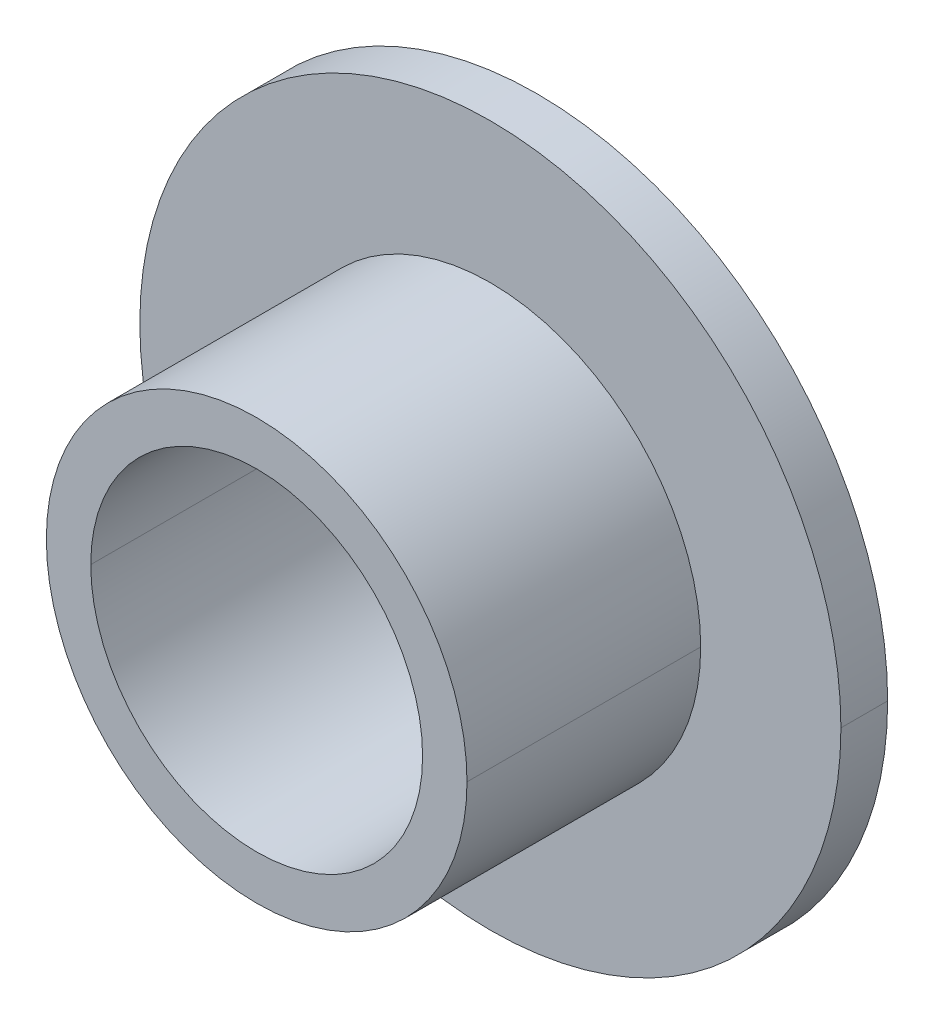
ISO-10303-21;
HEADER;
FILE_DESCRIPTION(('STEP AP214'),'2;1');
FILE_NAME('part.step','',(''),(''),'','','');
FILE_SCHEMA(('AUTOMOTIVE_DESIGN { 1 0 10303 214 1 1 1 1 }'));
ENDSEC;
DATA;
#1=APPLICATION_CONTEXT('core data for automotive mechanical design processes');
#2=APPLICATION_PROTOCOL_DEFINITION('international standard','automotive_design',2000,#1);
#3=PRODUCT_CONTEXT('',#1,'mechanical');
#4=PRODUCT('Part','Part','',(#3));
#5=PRODUCT_RELATED_PRODUCT_CATEGORY('part','',(#4));
#6=PRODUCT_DEFINITION_FORMATION('','',#4);
#7=PRODUCT_DEFINITION_CONTEXT('part definition',#1,'design');
#8=PRODUCT_DEFINITION('design','',#6,#7);
#9=PRODUCT_DEFINITION_SHAPE('','',#8);
#10=(LENGTH_UNIT() NAMED_UNIT(*) SI_UNIT(.MILLI.,.METRE.));
#11=(NAMED_UNIT(*) PLANE_ANGLE_UNIT() SI_UNIT($,.RADIAN.));
#12=(NAMED_UNIT(*) SI_UNIT($,.STERADIAN.) SOLID_ANGLE_UNIT());
#13=UNCERTAINTY_MEASURE_WITH_UNIT(LENGTH_MEASURE(1.E-05),#10,'distance_accuracy_value','');
#14=(GEOMETRIC_REPRESENTATION_CONTEXT(3) GLOBAL_UNCERTAINTY_ASSIGNED_CONTEXT((#13)) GLOBAL_UNIT_ASSIGNED_CONTEXT((#10,
#11,#12)) REPRESENTATION_CONTEXT('',''));
#15=CARTESIAN_POINT('',(0.,0.,0.));
#16=DIRECTION('',(0.,0.,1.));
#17=DIRECTION('',(1.,0.,0.));
#18=AXIS2_PLACEMENT_3D('',#15,#16,#17);
#19=CARTESIAN_POINT('',(0.,0.,6.));
#20=DIRECTION('',(0.,0.,-1.));
#21=DIRECTION('',(-1.,0.,0.));
#22=AXIS2_PLACEMENT_3D('',#19,#20,#21);
#23=CYLINDRICAL_SURFACE('',#22,4.5);
#24=DIRECTION('',(0.,0.,-1.));
#25=VECTOR('',#24,1.);
#26=CARTESIAN_POINT('',(4.5,0.,6.));
#27=LINE('',#26,#25);
#28=CARTESIAN_POINT('',(4.5,0.,6.));
#29=VERTEX_POINT('',#28);
#30=CARTESIAN_POINT('',(4.5,0.,1.));
#31=VERTEX_POINT('',#30);
#32=EDGE_CURVE('E73',#29,#31,#27,.T.);
#33=ORIENTED_EDGE('',*,*,#32,.F.);
#34=CARTESIAN_POINT('',(0.,0.,6.));
#35=DIRECTION('',(0.,0.,-1.));
#36=DIRECTION('',(-1.,0.,0.));
#37=AXIS2_PLACEMENT_3D('',#34,#35,#36);
#38=CIRCLE('',#37,4.5);
#39=CARTESIAN_POINT('',(-4.5,0.,6.));
#40=VERTEX_POINT('',#39);
#41=EDGE_CURVE('E83',#40,#29,#38,.F.);
#42=ORIENTED_EDGE('',*,*,#41,.F.);
#43=DIRECTION('',(0.,0.,-1.));
#44=VECTOR('',#43,1.);
#45=CARTESIAN_POINT('',(-4.5,0.,6.));
#46=LINE('',#45,#44);
#47=CARTESIAN_POINT('',(-4.5,0.,1.));
#48=VERTEX_POINT('',#47);
#49=EDGE_CURVE('E66',#48,#40,#46,.F.);
#50=ORIENTED_EDGE('',*,*,#49,.F.);
#51=CARTESIAN_POINT('',(0.,0.,1.));
#52=DIRECTION('',(0.,0.,-1.));
#53=DIRECTION('',(-1.,0.,0.));
#54=AXIS2_PLACEMENT_3D('',#51,#52,#53);
#55=CIRCLE('',#54,4.5);
#56=EDGE_CURVE('E82',#31,#48,#55,.T.);
#57=ORIENTED_EDGE('',*,*,#56,.F.);
#58=EDGE_LOOP('',(#33,#42,#50,#57));
#59=FACE_BOUND('',#58,.T.);
#60=ADVANCED_FACE('F17',(#59),#23,.T.);
#61=CARTESIAN_POINT('',(0.,0.,6.));
#62=DIRECTION('',(0.,0.,-1.));
#63=DIRECTION('',(-1.,0.,0.));
#64=AXIS2_PLACEMENT_3D('',#61,#62,#63);
#65=CYLINDRICAL_SURFACE('',#64,4.5);
#66=ORIENTED_EDGE('',*,*,#49,.T.);
#67=CARTESIAN_POINT('',(0.,0.,6.));
#68=DIRECTION('',(0.,0.,-1.));
#69=DIRECTION('',(-1.,0.,0.));
#70=AXIS2_PLACEMENT_3D('',#67,#68,#69);
#71=CIRCLE('',#70,4.5);
#72=EDGE_CURVE('E77',#29,#40,#71,.F.);
#73=ORIENTED_EDGE('',*,*,#72,.F.);
#74=ORIENTED_EDGE('',*,*,#32,.T.);
#75=CARTESIAN_POINT('',(0.,0.,1.));
#76=DIRECTION('',(0.,0.,-1.));
#77=DIRECTION('',(-1.,0.,0.));
#78=AXIS2_PLACEMENT_3D('',#75,#76,#77);
#79=CIRCLE('',#78,4.5);
#80=EDGE_CURVE('E20',#48,#31,#79,.T.);
#81=ORIENTED_EDGE('',*,*,#80,.F.);
#82=EDGE_LOOP('',(#66,#73,#74,#81));
#83=FACE_BOUND('',#82,.T.);
#84=ADVANCED_FACE('F75',(#83),#65,.T.);
#85=CARTESIAN_POINT('',(0.,0.,1.));
#86=DIRECTION('',(0.,0.,1.));
#87=DIRECTION('',(1.,0.,0.));
#88=AXIS2_PLACEMENT_3D('',#85,#86,#87);
#89=PLANE('',#88);
#90=ORIENTED_EDGE('',*,*,#80,.T.);
#91=ORIENTED_EDGE('',*,*,#56,.T.);
#92=EDGE_LOOP('',(#90,#91));
#93=FACE_BOUND('',#92,.T.);
#94=CARTESIAN_POINT('',(0.,0.,1.));
#95=DIRECTION('',(0.,0.,-1.));
#96=DIRECTION('',(-1.,0.,0.));
#97=AXIS2_PLACEMENT_3D('',#94,#95,#96);
#98=CIRCLE('',#97,7.5);
#99=CARTESIAN_POINT('',(7.5,0.,1.));
#100=VERTEX_POINT('',#99);
#101=CARTESIAN_POINT('',(-7.5,0.,1.));
#102=VERTEX_POINT('',#101);
#103=EDGE_CURVE('E87',#100,#102,#98,.T.);
#104=ORIENTED_EDGE('',*,*,#103,.F.);
#105=CARTESIAN_POINT('',(0.,0.,1.));
#106=DIRECTION('',(0.,0.,-1.));
#107=DIRECTION('',(-1.,0.,0.));
#108=AXIS2_PLACEMENT_3D('',#105,#106,#107);
#109=CIRCLE('',#108,7.5);
#110=EDGE_CURVE('E90',#102,#100,#109,.T.);
#111=ORIENTED_EDGE('',*,*,#110,.F.);
#112=EDGE_LOOP('',(#104,#111));
#113=FACE_BOUND('',#112,.T.);
#114=ADVANCED_FACE('F80',(#93,#113),#89,.T.);
#115=CARTESIAN_POINT('',(0.,0.,6.));
#116=DIRECTION('',(0.,0.,1.));
#117=DIRECTION('',(1.,0.,0.));
#118=AXIS2_PLACEMENT_3D('',#115,#116,#117);
#119=PLANE('',#118);
#120=CARTESIAN_POINT('',(0.,0.,6.));
#121=DIRECTION('',(0.,0.,-1.));
#122=DIRECTION('',(-1.,0.,0.));
#123=AXIS2_PLACEMENT_3D('',#120,#121,#122);
#124=CIRCLE('',#123,3.55);
#125=CARTESIAN_POINT('',(3.55,0.,6.));
#126=VERTEX_POINT('',#125);
#127=CARTESIAN_POINT('',(-3.55,0.,6.));
#128=VERTEX_POINT('',#127);
#129=EDGE_CURVE('E93',#126,#128,#124,.T.);
#130=ORIENTED_EDGE('',*,*,#129,.T.);
#131=CARTESIAN_POINT('',(0.,0.,6.));
#132=DIRECTION('',(0.,0.,-1.));
#133=DIRECTION('',(-1.,0.,0.));
#134=AXIS2_PLACEMENT_3D('',#131,#132,#133);
#135=CIRCLE('',#134,3.55);
#136=EDGE_CURVE('E97',#128,#126,#135,.T.);
#137=ORIENTED_EDGE('',*,*,#136,.T.);
#138=EDGE_LOOP('',(#130,#137));
#139=FACE_BOUND('',#138,.T.);
#140=ORIENTED_EDGE('',*,*,#41,.T.);
#141=ORIENTED_EDGE('',*,*,#72,.T.);
#142=EDGE_LOOP('',(#140,#141));
#143=FACE_BOUND('',#142,.T.);
#144=ADVANCED_FACE('F133',(#139,#143),#119,.T.);
#145=CARTESIAN_POINT('',(0.,0.,1.));
#146=DIRECTION('',(0.,0.,-1.));
#147=DIRECTION('',(-1.,0.,0.));
#148=AXIS2_PLACEMENT_3D('',#145,#146,#147);
#149=CYLINDRICAL_SURFACE('',#148,7.5);
#150=DIRECTION('',(0.,0.,-1.));
#151=VECTOR('',#150,1.);
#152=CARTESIAN_POINT('',(7.5,0.,1.));
#153=LINE('',#152,#151);
#154=CARTESIAN_POINT('',(7.5,0.,0.));
#155=VERTEX_POINT('',#154);
#156=EDGE_CURVE('E89',#100,#155,#153,.T.);
#157=ORIENTED_EDGE('',*,*,#156,.F.);
#158=ORIENTED_EDGE('',*,*,#103,.T.);
#159=DIRECTION('',(0.,0.,-1.));
#160=VECTOR('',#159,1.);
#161=CARTESIAN_POINT('',(-7.5,0.,1.));
#162=LINE('',#161,#160);
#163=CARTESIAN_POINT('',(-7.5,0.,0.));
#164=VERTEX_POINT('',#163);
#165=EDGE_CURVE('E94',#164,#102,#162,.F.);
#166=ORIENTED_EDGE('',*,*,#165,.F.);
#167=CARTESIAN_POINT('',(0.,0.,0.));
#168=DIRECTION('',(0.,0.,-1.));
#169=DIRECTION('',(-1.,0.,0.));
#170=AXIS2_PLACEMENT_3D('',#167,#168,#169);
#171=CIRCLE('',#170,7.5);
#172=EDGE_CURVE('E101',#164,#155,#171,.F.);
#173=ORIENTED_EDGE('',*,*,#172,.T.);
#174=EDGE_LOOP('',(#157,#158,#166,#173));
#175=FACE_BOUND('',#174,.T.);
#176=ADVANCED_FACE('F128',(#175),#149,.T.);
#177=CARTESIAN_POINT('',(0.,0.,1.));
#178=DIRECTION('',(0.,0.,-1.));
#179=DIRECTION('',(-1.,0.,0.));
#180=AXIS2_PLACEMENT_3D('',#177,#178,#179);
#181=CYLINDRICAL_SURFACE('',#180,7.5);
#182=ORIENTED_EDGE('',*,*,#165,.T.);
#183=ORIENTED_EDGE('',*,*,#110,.T.);
#184=ORIENTED_EDGE('',*,*,#156,.T.);
#185=CARTESIAN_POINT('',(0.,0.,0.));
#186=DIRECTION('',(0.,0.,-1.));
#187=DIRECTION('',(-1.,0.,0.));
#188=AXIS2_PLACEMENT_3D('',#185,#186,#187);
#189=CIRCLE('',#188,7.5);
#190=EDGE_CURVE('E104',#155,#164,#189,.F.);
#191=ORIENTED_EDGE('',*,*,#190,.T.);
#192=EDGE_LOOP('',(#182,#183,#184,#191));
#193=FACE_BOUND('',#192,.T.);
#194=ADVANCED_FACE('F131',(#193),#181,.T.);
#195=CARTESIAN_POINT('',(0.,0.,6.));
#196=DIRECTION('',(0.,0.,-1.));
#197=DIRECTION('',(-1.,0.,0.));
#198=AXIS2_PLACEMENT_3D('',#195,#196,#197);
#199=CYLINDRICAL_SURFACE('',#198,3.55);
#200=CARTESIAN_POINT('',(0.,0.,0.));
#201=DIRECTION('',(0.,0.,-1.));
#202=DIRECTION('',(-1.,0.,0.));
#203=AXIS2_PLACEMENT_3D('',#200,#201,#202);
#204=CIRCLE('',#203,3.55);
#205=CARTESIAN_POINT('',(3.55,0.,0.));
#206=VERTEX_POINT('',#205);
#207=CARTESIAN_POINT('',(-3.55,0.,0.));
#208=VERTEX_POINT('',#207);
#209=EDGE_CURVE('E26',#206,#208,#204,.T.);
#210=ORIENTED_EDGE('',*,*,#209,.T.);
#211=DIRECTION('',(0.,0.,-1.));
#212=VECTOR('',#211,1.);
#213=CARTESIAN_POINT('',(-3.55,0.,6.));
#214=LINE('',#213,#212);
#215=EDGE_CURVE('E34',#208,#128,#214,.F.);
#216=ORIENTED_EDGE('',*,*,#215,.T.);
#217=ORIENTED_EDGE('',*,*,#129,.F.);
#218=DIRECTION('',(0.,0.,-1.));
#219=VECTOR('',#218,1.);
#220=CARTESIAN_POINT('',(3.55,0.,6.));
#221=LINE('',#220,#219);
#222=EDGE_CURVE('E100',#126,#206,#221,.T.);
#223=ORIENTED_EDGE('',*,*,#222,.T.);
#224=EDGE_LOOP('',(#210,#216,#217,#223));
#225=FACE_BOUND('',#224,.T.);
#226=ADVANCED_FACE('F117',(#225),#199,.F.);
#227=CARTESIAN_POINT('',(0.,0.,6.));
#228=DIRECTION('',(0.,0.,-1.));
#229=DIRECTION('',(-1.,0.,0.));
#230=AXIS2_PLACEMENT_3D('',#227,#228,#229);
#231=CYLINDRICAL_SURFACE('',#230,3.55);
#232=CARTESIAN_POINT('',(0.,0.,0.));
#233=DIRECTION('',(0.,0.,-1.));
#234=DIRECTION('',(-1.,0.,0.));
#235=AXIS2_PLACEMENT_3D('',#232,#233,#234);
#236=CIRCLE('',#235,3.55);
#237=EDGE_CURVE('E11',#208,#206,#236,.T.);
#238=ORIENTED_EDGE('',*,*,#237,.T.);
#239=ORIENTED_EDGE('',*,*,#222,.F.);
#240=ORIENTED_EDGE('',*,*,#136,.F.);
#241=ORIENTED_EDGE('',*,*,#215,.F.);
#242=EDGE_LOOP('',(#238,#239,#240,#241));
#243=FACE_BOUND('',#242,.T.);
#244=ADVANCED_FACE('F118',(#243),#231,.F.);
#245=CARTESIAN_POINT('',(0.,0.,0.));
#246=DIRECTION('',(0.,0.,1.));
#247=DIRECTION('',(1.,0.,0.));
#248=AXIS2_PLACEMENT_3D('',#245,#246,#247);
#249=PLANE('',#248);
#250=ORIENTED_EDGE('',*,*,#209,.F.);
#251=ORIENTED_EDGE('',*,*,#237,.F.);
#252=EDGE_LOOP('',(#250,#251));
#253=FACE_BOUND('',#252,.T.);
#254=ORIENTED_EDGE('',*,*,#172,.F.);
#255=ORIENTED_EDGE('',*,*,#190,.F.);
#256=EDGE_LOOP('',(#254,#255));
#257=FACE_BOUND('',#256,.T.);
#258=ADVANCED_FACE('F120',(#253,#257),#249,.F.);
#259=CLOSED_SHELL('',(#60,#84,#114,#144,#176,#194,#226,#244,#258));
#260=MANIFOLD_SOLID_BREP('B1',#259);
#261=ADVANCED_BREP_SHAPE_REPRESENTATION('',(#18,#260),#14);
#262=SHAPE_DEFINITION_REPRESENTATION(#9,#261);
ENDSEC;
END-ISO-10303-21;
